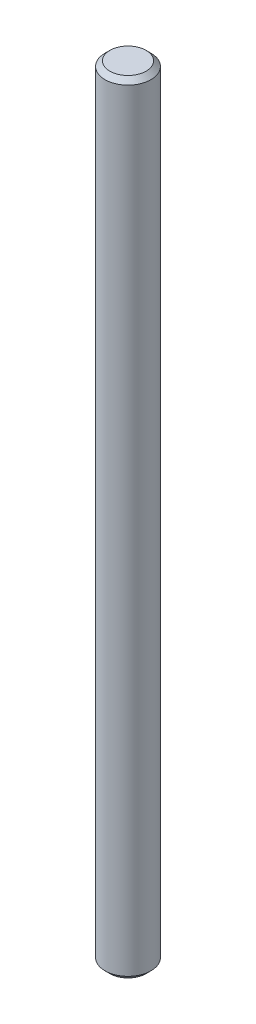
ISO-10303-21;
HEADER;
FILE_DESCRIPTION(('STEP AP214'),'2;1');
FILE_NAME('part.step','',(''),(''),'','','');
FILE_SCHEMA(('AUTOMOTIVE_DESIGN { 1 0 10303 214 1 1 1 1 }'));
ENDSEC;
DATA;
#1=APPLICATION_CONTEXT('core data for automotive mechanical design processes');
#2=APPLICATION_PROTOCOL_DEFINITION('international standard','automotive_design',2000,#1);
#3=PRODUCT_CONTEXT('',#1,'mechanical');
#4=PRODUCT('Part','Part','',(#3));
#5=PRODUCT_RELATED_PRODUCT_CATEGORY('part','',(#4));
#6=PRODUCT_DEFINITION_FORMATION('','',#4);
#7=PRODUCT_DEFINITION_CONTEXT('part definition',#1,'design');
#8=PRODUCT_DEFINITION('design','',#6,#7);
#9=PRODUCT_DEFINITION_SHAPE('','',#8);
#10=(LENGTH_UNIT() NAMED_UNIT(*) SI_UNIT(.MILLI.,.METRE.));
#11=(NAMED_UNIT(*) PLANE_ANGLE_UNIT() SI_UNIT($,.RADIAN.));
#12=(NAMED_UNIT(*) SI_UNIT($,.STERADIAN.) SOLID_ANGLE_UNIT());
#13=UNCERTAINTY_MEASURE_WITH_UNIT(LENGTH_MEASURE(1.E-05),#10,'distance_accuracy_value','');
#14=(GEOMETRIC_REPRESENTATION_CONTEXT(3) GLOBAL_UNCERTAINTY_ASSIGNED_CONTEXT((#13)) GLOBAL_UNIT_ASSIGNED_CONTEXT((#10,
#11,#12)) REPRESENTATION_CONTEXT('',''));
#15=CARTESIAN_POINT('',(0.,0.,0.));
#16=DIRECTION('',(0.,0.,1.));
#17=DIRECTION('',(1.,0.,0.));
#18=AXIS2_PLACEMENT_3D('',#15,#16,#17);
#19=CARTESIAN_POINT('',(0.,80.,0.));
#20=DIRECTION('',(0.,-1.,0.));
#21=DIRECTION('',(0.,0.,-1.));
#22=AXIS2_PLACEMENT_3D('',#19,#20,#21);
#23=CYLINDRICAL_SURFACE('',#22,2.35);
#24=CARTESIAN_POINT('',(0.,0.500000000000014,0.));
#25=DIRECTION('',(0.,1.,0.));
#26=DIRECTION('',(0.,0.,1.));
#27=AXIS2_PLACEMENT_3D('',#24,#25,#26);
#28=CIRCLE('',#27,2.35);
#29=CARTESIAN_POINT('',(0.,0.500000000000014,2.35));
#30=VERTEX_POINT('',#29);
#31=EDGE_CURVE('E59',#30,#30,#28,.T.);
#32=ORIENTED_EDGE('',*,*,#31,.T.);
#33=EDGE_LOOP('',(#32));
#34=FACE_BOUND('',#33,.T.);
#35=CARTESIAN_POINT('',(0.,79.5,0.));
#36=DIRECTION('',(0.,1.,0.));
#37=DIRECTION('',(0.,0.,1.));
#38=AXIS2_PLACEMENT_3D('',#35,#36,#37);
#39=CIRCLE('',#38,2.35);
#40=CARTESIAN_POINT('',(0.,79.5,2.35));
#41=VERTEX_POINT('',#40);
#42=EDGE_CURVE('E64',#41,#41,#39,.F.);
#43=ORIENTED_EDGE('',*,*,#42,.T.);
#44=EDGE_LOOP('',(#43));
#45=FACE_BOUND('',#44,.T.);
#46=ADVANCED_FACE('F45',(#34,#45),#23,.T.);
#47=CARTESIAN_POINT('',(0.,80.,0.));
#48=DIRECTION('',(0.,1.,0.));
#49=DIRECTION('',(0.,0.,1.));
#50=AXIS2_PLACEMENT_3D('',#47,#48,#49);
#51=PLANE('',#50);
#52=CARTESIAN_POINT('',(0.,80.,0.));
#53=DIRECTION('',(0.,1.,0.));
#54=DIRECTION('',(0.,0.,1.));
#55=AXIS2_PLACEMENT_3D('',#52,#53,#54);
#56=CIRCLE('',#55,1.85);
#57=CARTESIAN_POINT('',(0.,80.,1.85));
#58=VERTEX_POINT('',#57);
#59=EDGE_CURVE('E10',#58,#58,#56,.T.);
#60=ORIENTED_EDGE('',*,*,#59,.T.);
#61=EDGE_LOOP('',(#60));
#62=FACE_BOUND('',#61,.T.);
#63=ADVANCED_FACE('F81',(#62),#51,.T.);
#64=CARTESIAN_POINT('',(0.,0.,0.));
#65=DIRECTION('',(0.,1.,0.));
#66=DIRECTION('',(0.,0.,1.));
#67=AXIS2_PLACEMENT_3D('',#64,#65,#66);
#68=PLANE('',#67);
#69=CARTESIAN_POINT('',(0.,0.,0.));
#70=DIRECTION('',(0.,1.,0.));
#71=DIRECTION('',(0.,0.,1.));
#72=AXIS2_PLACEMENT_3D('',#69,#70,#71);
#73=CIRCLE('',#72,1.84999999999998);
#74=CARTESIAN_POINT('',(0.,0.,1.84999999999998));
#75=VERTEX_POINT('',#74);
#76=EDGE_CURVE('E54',#75,#75,#73,.F.);
#77=ORIENTED_EDGE('',*,*,#76,.T.);
#78=EDGE_LOOP('',(#77));
#79=FACE_BOUND('',#78,.T.);
#80=ADVANCED_FACE('F78',(#79),#68,.F.);
#81=CARTESIAN_POINT('',(0.,0.500000000000014,0.));
#82=DIRECTION('',(0.,1.,0.));
#83=DIRECTION('',(0.,0.,1.));
#84=AXIS2_PLACEMENT_3D('',#81,#82,#83);
#85=CONICAL_SURFACE('',#84,2.35,0.78539816339745);
#86=ORIENTED_EDGE('',*,*,#76,.F.);
#87=EDGE_LOOP('',(#86));
#88=FACE_BOUND('',#87,.T.);
#89=ORIENTED_EDGE('',*,*,#31,.F.);
#90=EDGE_LOOP('',(#89));
#91=FACE_BOUND('',#90,.T.);
#92=ADVANCED_FACE('F74',(#88,#91),#85,.T.);
#93=CARTESIAN_POINT('',(0.,80.,0.));
#94=DIRECTION('',(0.,-1.,0.));
#95=DIRECTION('',(0.,0.,-1.));
#96=AXIS2_PLACEMENT_3D('',#93,#94,#95);
#97=CONICAL_SURFACE('',#96,1.85,0.78539816339745);
#98=ORIENTED_EDGE('',*,*,#42,.F.);
#99=EDGE_LOOP('',(#98));
#100=FACE_BOUND('',#99,.T.);
#101=ORIENTED_EDGE('',*,*,#59,.F.);
#102=EDGE_LOOP('',(#101));
#103=FACE_BOUND('',#102,.T.);
#104=ADVANCED_FACE('F48',(#100,#103),#97,.T.);
#105=CLOSED_SHELL('',(#46,#63,#80,#92,#104));
#106=MANIFOLD_SOLID_BREP('B2',#105);
#107=ADVANCED_BREP_SHAPE_REPRESENTATION('',(#18,#106),#14);
#108=SHAPE_DEFINITION_REPRESENTATION(#9,#107);
ENDSEC;
END-ISO-10303-21;
